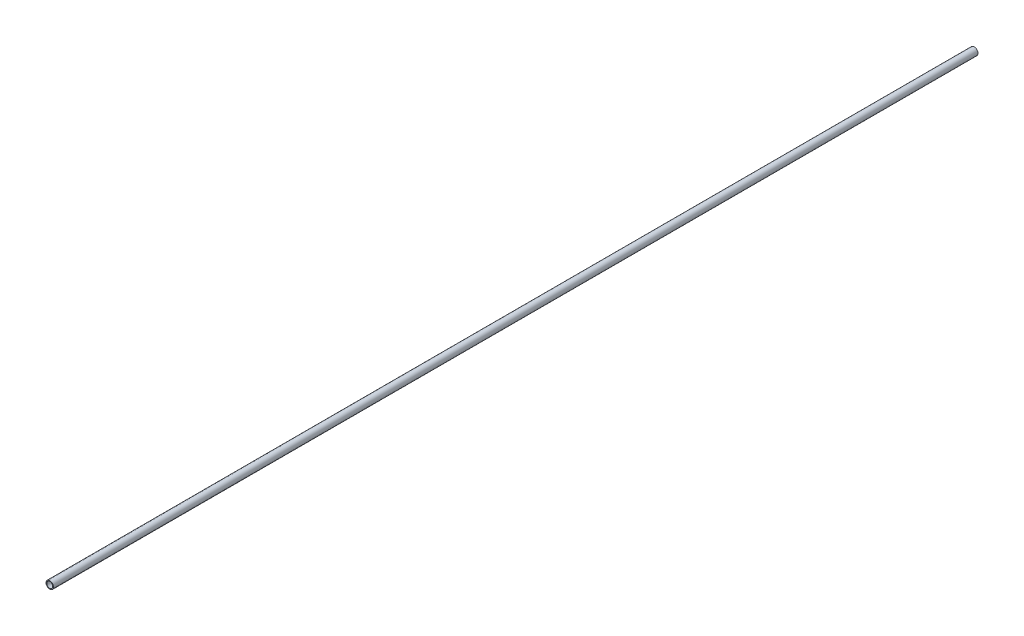
ISO-10303-21;
HEADER;
FILE_DESCRIPTION(('STEP AP214'),'2;1');
FILE_NAME('part.step','',(''),(''),'','','');
FILE_SCHEMA(('AUTOMOTIVE_DESIGN { 1 0 10303 214 1 1 1 1 }'));
ENDSEC;
DATA;
#1=APPLICATION_CONTEXT('core data for automotive mechanical design processes');
#2=APPLICATION_PROTOCOL_DEFINITION('international standard','automotive_design',2000,#1);
#3=PRODUCT_CONTEXT('',#1,'mechanical');
#4=PRODUCT('Part','Part','',(#3));
#5=PRODUCT_RELATED_PRODUCT_CATEGORY('part','',(#4));
#6=PRODUCT_DEFINITION_FORMATION('','',#4);
#7=PRODUCT_DEFINITION_CONTEXT('part definition',#1,'design');
#8=PRODUCT_DEFINITION('design','',#6,#7);
#9=PRODUCT_DEFINITION_SHAPE('','',#8);
#10=(LENGTH_UNIT() NAMED_UNIT(*) SI_UNIT(.MILLI.,.METRE.));
#11=(NAMED_UNIT(*) PLANE_ANGLE_UNIT() SI_UNIT($,.RADIAN.));
#12=(NAMED_UNIT(*) SI_UNIT($,.STERADIAN.) SOLID_ANGLE_UNIT());
#13=UNCERTAINTY_MEASURE_WITH_UNIT(LENGTH_MEASURE(1.E-05),#10,'distance_accuracy_value','');
#14=(GEOMETRIC_REPRESENTATION_CONTEXT(3) GLOBAL_UNCERTAINTY_ASSIGNED_CONTEXT((#13)) GLOBAL_UNIT_ASSIGNED_CONTEXT((#10,
#11,#12)) REPRESENTATION_CONTEXT('',''));
#15=CARTESIAN_POINT('',(0.,0.,0.));
#16=DIRECTION('',(0.,0.,1.));
#17=DIRECTION('',(1.,0.,0.));
#18=AXIS2_PLACEMENT_3D('',#15,#16,#17);
#19=CARTESIAN_POINT('',(0.,0.,1230.));
#20=DIRECTION('',(0.,0.,1.));
#21=DIRECTION('',(1.,0.,0.));
#22=AXIS2_PLACEMENT_3D('',#19,#20,#21);
#23=PLANE('',#22);
#24=CARTESIAN_POINT('',(0.,0.,1230.));
#25=DIRECTION('',(0.,0.,1.));
#26=DIRECTION('',(1.,0.,0.));
#27=AXIS2_PLACEMENT_3D('',#24,#25,#26);
#28=CIRCLE('',#27,5.);
#29=CARTESIAN_POINT('',(5.,0.,1230.));
#30=VERTEX_POINT('',#29);
#31=EDGE_CURVE('E10',#30,#30,#28,.T.);
#32=ORIENTED_EDGE('',*,*,#31,.T.);
#33=EDGE_LOOP('',(#32));
#34=FACE_BOUND('',#33,.T.);
#35=CARTESIAN_POINT('',(0.,0.,1230.));
#36=DIRECTION('',(0.,0.,1.));
#37=DIRECTION('',(1.,0.,0.));
#38=AXIS2_PLACEMENT_3D('',#35,#36,#37);
#39=CIRCLE('',#38,4.);
#40=CARTESIAN_POINT('',(4.,0.,1230.));
#41=VERTEX_POINT('',#40);
#42=EDGE_CURVE('E50',#41,#41,#39,.T.);
#43=ORIENTED_EDGE('',*,*,#42,.F.);
#44=EDGE_LOOP('',(#43));
#45=FACE_BOUND('',#44,.T.);
#46=ADVANCED_FACE('F39',(#34,#45),#23,.T.);
#47=CARTESIAN_POINT('',(0.,0.,0.));
#48=DIRECTION('',(0.,0.,1.));
#49=DIRECTION('',(1.,0.,0.));
#50=AXIS2_PLACEMENT_3D('',#47,#48,#49);
#51=PLANE('',#50);
#52=CARTESIAN_POINT('',(0.,0.,0.));
#53=DIRECTION('',(0.,0.,1.));
#54=DIRECTION('',(1.,0.,0.));
#55=AXIS2_PLACEMENT_3D('',#52,#53,#54);
#56=CIRCLE('',#55,5.);
#57=CARTESIAN_POINT('',(5.,0.,0.));
#58=VERTEX_POINT('',#57);
#59=EDGE_CURVE('E43',#58,#58,#56,.T.);
#60=ORIENTED_EDGE('',*,*,#59,.F.);
#61=EDGE_LOOP('',(#60));
#62=FACE_BOUND('',#61,.T.);
#63=CARTESIAN_POINT('',(0.,0.,0.));
#64=DIRECTION('',(0.,0.,1.));
#65=DIRECTION('',(1.,0.,0.));
#66=AXIS2_PLACEMENT_3D('',#63,#64,#65);
#67=CIRCLE('',#66,4.);
#68=CARTESIAN_POINT('',(4.,0.,0.));
#69=VERTEX_POINT('',#68);
#70=EDGE_CURVE('E52',#69,#69,#67,.T.);
#71=ORIENTED_EDGE('',*,*,#70,.T.);
#72=EDGE_LOOP('',(#71));
#73=FACE_BOUND('',#72,.T.);
#74=ADVANCED_FACE('F62',(#62,#73),#51,.F.);
#75=CARTESIAN_POINT('',(0.,0.,1230.));
#76=DIRECTION('',(0.,0.,-1.));
#77=DIRECTION('',(-1.,0.,0.));
#78=AXIS2_PLACEMENT_3D('',#75,#76,#77);
#79=CYLINDRICAL_SURFACE('',#78,5.);
#80=ORIENTED_EDGE('',*,*,#31,.F.);
#81=EDGE_LOOP('',(#80));
#82=FACE_BOUND('',#81,.T.);
#83=ORIENTED_EDGE('',*,*,#59,.T.);
#84=EDGE_LOOP('',(#83));
#85=FACE_BOUND('',#84,.T.);
#86=ADVANCED_FACE('F41',(#82,#85),#79,.T.);
#87=CARTESIAN_POINT('',(0.,0.,1230.));
#88=DIRECTION('',(0.,0.,-1.));
#89=DIRECTION('',(-1.,0.,0.));
#90=AXIS2_PLACEMENT_3D('',#87,#88,#89);
#91=CYLINDRICAL_SURFACE('',#90,4.);
#92=ORIENTED_EDGE('',*,*,#42,.T.);
#93=EDGE_LOOP('',(#92));
#94=FACE_BOUND('',#93,.T.);
#95=ORIENTED_EDGE('',*,*,#70,.F.);
#96=EDGE_LOOP('',(#95));
#97=FACE_BOUND('',#96,.T.);
#98=ADVANCED_FACE('F58',(#94,#97),#91,.F.);
#99=CLOSED_SHELL('',(#46,#74,#86,#98));
#100=MANIFOLD_SOLID_BREP('B2',#99);
#101=ADVANCED_BREP_SHAPE_REPRESENTATION('',(#18,#100),#14);
#102=SHAPE_DEFINITION_REPRESENTATION(#9,#101);
ENDSEC;
END-ISO-10303-21;
